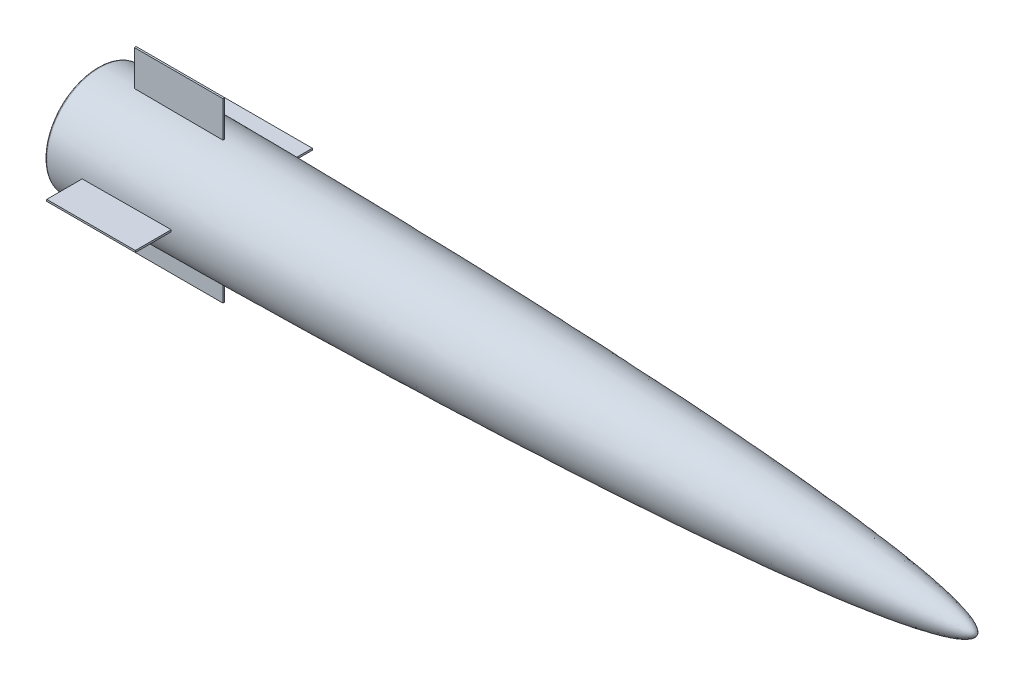
ISO-10303-21;
HEADER;
FILE_DESCRIPTION(('STEP AP214'),'2;1');
FILE_NAME('part.step','',(''),(''),'','','');
FILE_SCHEMA(('AUTOMOTIVE_DESIGN { 1 0 10303 214 1 1 1 1 }'));
ENDSEC;
DATA;
#1=APPLICATION_CONTEXT('core data for automotive mechanical design processes');
#2=APPLICATION_PROTOCOL_DEFINITION('international standard','automotive_design',2000,#1);
#3=PRODUCT_CONTEXT('',#1,'mechanical');
#4=PRODUCT('Part','Part','',(#3));
#5=PRODUCT_RELATED_PRODUCT_CATEGORY('part','',(#4));
#6=PRODUCT_DEFINITION_FORMATION('','',#4);
#7=PRODUCT_DEFINITION_CONTEXT('part definition',#1,'design');
#8=PRODUCT_DEFINITION('design','',#6,#7);
#9=PRODUCT_DEFINITION_SHAPE('','',#8);
#10=(LENGTH_UNIT() NAMED_UNIT(*) SI_UNIT(.MILLI.,.METRE.));
#11=(NAMED_UNIT(*) PLANE_ANGLE_UNIT() SI_UNIT($,.RADIAN.));
#12=(NAMED_UNIT(*) SI_UNIT($,.STERADIAN.) SOLID_ANGLE_UNIT());
#13=UNCERTAINTY_MEASURE_WITH_UNIT(LENGTH_MEASURE(1.E-05),#10,'distance_accuracy_value','');
#14=(GEOMETRIC_REPRESENTATION_CONTEXT(3) GLOBAL_UNCERTAINTY_ASSIGNED_CONTEXT((#13)) GLOBAL_UNIT_ASSIGNED_CONTEXT((#10,
#11,#12)) REPRESENTATION_CONTEXT('',''));
#15=CARTESIAN_POINT('',(0.,0.,0.));
#16=DIRECTION('',(0.,0.,1.));
#17=DIRECTION('',(1.,0.,0.));
#18=AXIS2_PLACEMENT_3D('',#15,#16,#17);
#19=CARTESIAN_POINT('',(-990.,0.,0.));
#20=DIRECTION('',(0.,0.,1.));
#21=DIRECTION('',(0.,1.,0.));
#22=AXIS2_PLACEMENT_3D('',#19,#20,#21);
#23=ELLIPSE('',#22,60.,10.);
#24=TRIMMED_CURVE('',#23,(PARAMETER_VALUE(4.71238898038468)),
(PARAMETER_VALUE(7.85398163397449)),.T.,.PARAMETER.);
#25=CARTESIAN_POINT('',(-1000.,-3.49148133884313E-13,0.));
#26=DIRECTION('',(-1.,0.,0.));
#27=AXIS1_PLACEMENT('',#25,#26);
#28=SURFACE_OF_REVOLUTION('',#24,#27);
#29=CARTESIAN_POINT('',(-1000.,-3.49148133884313E-13,0.));
#30=VERTEX_POINT('',#29);
#31=VERTEX_LOOP('',#30);
#32=FACE_BOUND('',#31,.T.);
#33=CARTESIAN_POINT('',(-990.,-3.38673689867784E-13,0.));
#34=DIRECTION('',(-1.,0.,0.));
#35=DIRECTION('',(0.,-1.,0.));
#36=AXIS2_PLACEMENT_3D('',#33,#34,#35);
#37=CIRCLE('',#36,60.0000000000003);
#38=CARTESIAN_POINT('',(-990.,-60.0000000000007,0.));
#39=VERTEX_POINT('',#38);
#40=EDGE_CURVE('E251',#39,#39,#37,.T.);
#41=ORIENTED_EDGE('',*,*,#40,.T.);
#42=EDGE_LOOP('',(#41));
#43=FACE_BOUND('',#42,.T.);
#44=ADVANCED_FACE('F42',(#32,#43),#28,.T.);
#45=CARTESIAN_POINT('',(-990.,0.,0.));
#46=DIRECTION('',(0.,0.,1.));
#47=DIRECTION('',(-1.,0.,0.));
#48=AXIS2_PLACEMENT_3D('',#45,#46,#47);
#49=ELLIPSE('',#48,990.,60.);
#50=TRIMMED_CURVE('',#49,(PARAMETER_VALUE(3.1415926535898)),(PARAMETER_VALUE(6.28318530717961)),
.T.,.PARAMETER.);
#51=CARTESIAN_POINT('',(-1000.,-3.49148133884313E-13,0.));
#52=DIRECTION('',(-1.,0.,0.));
#53=AXIS1_PLACEMENT('',#51,#52);
#54=SURFACE_OF_REVOLUTION('',#50,#53);
#55=CARTESIAN_POINT('',(-850.,-1.92031473636372E-13,0.));
#56=DIRECTION('',(-1.,0.,0.));
#57=DIRECTION('',(0.,-1.,0.));
#58=AXIS2_PLACEMENT_3D('',#55,#56,#57);
#59=CIRCLE('',#58,59.397031459402);
#60=CARTESIAN_POINT('',(-850.,0.999999999998913,-59.388612933703));
#61=VERTEX_POINT('',#60);
#62=CARTESIAN_POINT('',(-850.,-1.00000000000108,-59.3886129337029));
#63=VERTEX_POINT('',#62);
#64=EDGE_CURVE('E55',#61,#63,#59,.T.);
#65=ORIENTED_EDGE('',*,*,#64,.F.);
#66=CARTESIAN_POINT('',(-850.,0.999999999998912,-59.3886129337029));
#67=CARTESIAN_POINT('',(-854.166589941151,0.999999999998908,-59.4246902327038));
#68=CARTESIAN_POINT('',(-858.33319409252,0.999999999998904,-59.4591248088546));
#69=CARTESIAN_POINT('',(-866.666420572331,0.999999999998896,-59.5247241075129));
#70=CARTESIAN_POINT('',(-870.833042900726,0.999999999998891,-59.555888835957));
#71=CARTESIAN_POINT('',(-879.166305615929,0.999999999998882,-59.6149641266672));
#72=CARTESIAN_POINT('',(-883.33294600271,0.999999999998878,-59.6428746928422));
#73=CARTESIAN_POINT('',(-891.666244741786,0.999999999998869,-59.6954551993926));
#74=CARTESIAN_POINT('',(-895.83290309407,0.999999999998865,-59.7201251416959));
#75=CARTESIAN_POINT('',(-904.166237595471,0.999999999998856,-59.7662364200167));
#76=CARTESIAN_POINT('',(-908.332913744589,0.999999999998851,-59.7876777560845));
#77=CARTESIAN_POINT('',(-916.666283889618,0.999999999998843,-59.8273421579692));
#78=CARTESIAN_POINT('',(-920.83297788554,0.999999999998838,-59.8455652218311));
#79=CARTESIAN_POINT('',(-929.16638368884,0.99999999999883,-59.8788019381598));
#80=CARTESIAN_POINT('',(-933.333095496234,0.999999999998825,-59.8938155867647));
#81=CARTESIAN_POINT('',(-941.666536898786,0.999999999998816,-59.9206403385491));
#82=CARTESIAN_POINT('',(-945.833266493963,0.999999999998812,-59.932451435981));
#83=CARTESIAN_POINT('',(-950.,0.999999999998807,-59.9426646777447));
#84=B_SPLINE_CURVE_WITH_KNOTS('',3,(#66,#67,#68,#69,#70,#71,#72,#73,#74,#75,#76,#77,#78,#79,#80,
#81,#82,#83),.UNSPECIFIED.,.F.,.F.,(4,2,2,2,2,2,2,2,4),(0.,12.5002380451016,25.0004533949478,
37.5006537296599,50.000846627544,62.5010393300494,75.0012396256015,87.5014549624844,
100.001692733604),.UNSPECIFIED.);
#85=CARTESIAN_POINT('',(-950.,0.999999999998808,-59.9426646777447));
#86=VERTEX_POINT('',#85);
#87=EDGE_CURVE('E11',#61,#86,#84,.T.);
#88=ORIENTED_EDGE('',*,*,#87,.T.);
#89=CARTESIAN_POINT('',(-950.,-2.96775913801666E-13,0.));
#90=DIRECTION('',(-1.,0.,0.));
#91=DIRECTION('',(0.,-1.,0.));
#92=AXIS2_PLACEMENT_3D('',#89,#90,#91);
#93=CIRCLE('',#92,59.9510054016489);
#94=CARTESIAN_POINT('',(-950.,-1.00000000000119,-59.9426646777446));
#95=VERTEX_POINT('',#94);
#96=EDGE_CURVE('E321',#95,#86,#93,.F.);
#97=ORIENTED_EDGE('',*,*,#96,.F.);
#98=CARTESIAN_POINT('',(-850.,-1.00000000000108,-59.3886129337029));
#99=CARTESIAN_POINT('',(-854.166589941151,-1.00000000000109,-59.4246902327038));
#100=CARTESIAN_POINT('',(-858.33319409252,-1.0000000000011,-59.4591248088546));
#101=CARTESIAN_POINT('',(-866.666420572331,-1.00000000000111,-59.5247241075129));
#102=CARTESIAN_POINT('',(-870.833042900726,-1.00000000000111,-59.5558888359569));
#103=CARTESIAN_POINT('',(-879.166305615929,-1.00000000000112,-59.6149641266672));
#104=CARTESIAN_POINT('',(-883.33294600271,-1.00000000000112,-59.6428746928421));
#105=CARTESIAN_POINT('',(-891.666244741786,-1.00000000000113,-59.6954551993925));
#106=CARTESIAN_POINT('',(-895.83290309407,-1.00000000000114,-59.7201251416959));
#107=CARTESIAN_POINT('',(-904.166237595471,-1.00000000000114,-59.7662364200166));
#108=CARTESIAN_POINT('',(-908.332913744589,-1.00000000000115,-59.7876777560845));
#109=CARTESIAN_POINT('',(-916.666283889618,-1.00000000000116,-59.8273421579692));
#110=CARTESIAN_POINT('',(-920.83297788554,-1.00000000000116,-59.8455652218311));
#111=CARTESIAN_POINT('',(-929.16638368884,-1.00000000000117,-59.8788019381598));
#112=CARTESIAN_POINT('',(-933.333095496234,-1.00000000000117,-59.8938155867647));
#113=CARTESIAN_POINT('',(-941.666536898786,-1.00000000000118,-59.9206403385491));
#114=CARTESIAN_POINT('',(-945.833266493963,-1.00000000000119,-59.9324514359809));
#115=CARTESIAN_POINT('',(-950.,-1.00000000000119,-59.9426646777446));
#116=B_SPLINE_CURVE_WITH_KNOTS('',3,(#98,#99,#100,#101,#102,#103,#104,#105,#106,#107,#108,#109,
#110,#111,#112,#113,#114,#115),.UNSPECIFIED.,.F.,.F.,(4,2,2,2,2,2,2,2,4),(0.,12.5002380451016,
25.0004533949478,37.5006537296599,50.0008466275439,62.5010393300493,75.0012396256014,
87.5014549624843,100.001692733604),.UNSPECIFIED.);
#117=EDGE_CURVE('E314',#63,#95,#116,.T.);
#118=ORIENTED_EDGE('',*,*,#117,.F.);
#119=EDGE_LOOP('',(#65,#88,#97,#118));
#120=FACE_BOUND('',#119,.T.);
#121=CARTESIAN_POINT('',(-850.,-59.3886129337031,-1.));
#122=VERTEX_POINT('',#121);
#123=CARTESIAN_POINT('',(-850.,-59.3886129337031,0.999999999999995));
#124=VERTEX_POINT('',#123);
#125=EDGE_CURVE('E389',#122,#124,#59,.T.);
#126=ORIENTED_EDGE('',*,*,#125,.F.);
#127=CARTESIAN_POINT('',(-850.,-59.3886129337031,-1.));
#128=CARTESIAN_POINT('',(-854.166589941151,-59.424690232704,-1.));
#129=CARTESIAN_POINT('',(-858.33319409252,-59.4591248088548,-1.));
#130=CARTESIAN_POINT('',(-866.666420572331,-59.5247241075131,-1.));
#131=CARTESIAN_POINT('',(-870.833042900726,-59.5558888359572,-1.));
#132=CARTESIAN_POINT('',(-879.166305615929,-59.6149641266674,-1.));
#133=CARTESIAN_POINT('',(-883.33294600271,-59.6428746928424,-1.));
#134=CARTESIAN_POINT('',(-891.666244741786,-59.6954551993928,-1.));
#135=CARTESIAN_POINT('',(-895.83290309407,-59.7201251416961,-1.));
#136=CARTESIAN_POINT('',(-904.166237595471,-59.7662364200169,-1.));
#137=CARTESIAN_POINT('',(-908.332913744589,-59.7876777560848,-1.));
#138=CARTESIAN_POINT('',(-916.666283889618,-59.8273421579695,-1.));
#139=CARTESIAN_POINT('',(-920.83297788554,-59.8455652218314,-1.));
#140=CARTESIAN_POINT('',(-929.16638368884,-59.8788019381601,-1.));
#141=CARTESIAN_POINT('',(-933.333095496234,-59.893815586765,-1.));
#142=CARTESIAN_POINT('',(-941.666536898786,-59.9206403385494,-1.));
#143=CARTESIAN_POINT('',(-945.833266493963,-59.9324514359812,-1.));
#144=CARTESIAN_POINT('',(-950.,-59.942664677745,-1.));
#145=B_SPLINE_CURVE_WITH_KNOTS('',3,(#127,#128,#129,#130,#131,#132,#133,#134,#135,#136,#137,
#138,#139,#140,#141,#142,#143,#144),.UNSPECIFIED.,.F.,.F.,(4,2,2,2,2,2,2,2,4),(0.,
12.5002380451016,25.0004533949478,37.5006537296599,50.0008466275439,62.5010393300493,
75.0012396256014,87.5014549624843,100.001692733604),.UNSPECIFIED.);
#146=CARTESIAN_POINT('',(-950.,-59.942664677745,-1.));
#147=VERTEX_POINT('',#146);
#148=EDGE_CURVE('E308',#122,#147,#145,.T.);
#149=ORIENTED_EDGE('',*,*,#148,.T.);
#150=CARTESIAN_POINT('',(-950.,-59.942664677745,1.));
#151=VERTEX_POINT('',#150);
#152=EDGE_CURVE('E386',#151,#147,#93,.F.);
#153=ORIENTED_EDGE('',*,*,#152,.F.);
#154=CARTESIAN_POINT('',(-850.,-59.3886129337031,0.999999999999995));
#155=CARTESIAN_POINT('',(-854.166589941151,-59.424690232704,0.999999999999998));
#156=CARTESIAN_POINT('',(-858.33319409252,-59.4591248088548,1.));
#157=CARTESIAN_POINT('',(-866.666420572331,-59.5247241075131,1.));
#158=CARTESIAN_POINT('',(-870.833042900726,-59.5558888359572,1.));
#159=CARTESIAN_POINT('',(-879.166305615929,-59.6149641266674,1.));
#160=CARTESIAN_POINT('',(-883.33294600271,-59.6428746928424,1.));
#161=CARTESIAN_POINT('',(-891.666244741786,-59.6954551993928,1.));
#162=CARTESIAN_POINT('',(-895.83290309407,-59.7201251416961,1.));
#163=CARTESIAN_POINT('',(-904.166237595471,-59.7662364200169,1.));
#164=CARTESIAN_POINT('',(-908.332913744589,-59.7876777560848,1.));
#165=CARTESIAN_POINT('',(-916.666283889618,-59.8273421579695,1.));
#166=CARTESIAN_POINT('',(-920.83297788554,-59.8455652218314,1.));
#167=CARTESIAN_POINT('',(-929.16638368884,-59.8788019381601,1.));
#168=CARTESIAN_POINT('',(-933.333095496234,-59.893815586765,1.));
#169=CARTESIAN_POINT('',(-941.666536898786,-59.9206403385494,0.999999999999999));
#170=CARTESIAN_POINT('',(-945.833266493963,-59.9324514359812,0.999999999999996));
#171=CARTESIAN_POINT('',(-950.,-59.942664677745,0.999999999999989));
#172=B_SPLINE_CURVE_WITH_KNOTS('',3,(#154,#155,#156,#157,#158,#159,#160,#161,#162,#163,#164,
#165,#166,#167,#168,#169,#170,#171),.UNSPECIFIED.,.F.,.F.,(4,2,2,2,2,2,2,2,4),(0.,
12.5002380451016,25.0004533949478,37.5006537296599,50.0008466275439,62.5010393300493,
75.0012396256014,87.5014549624843,100.001692733604),.UNSPECIFIED.);
#173=EDGE_CURVE('E301',#124,#151,#172,.T.);
#174=ORIENTED_EDGE('',*,*,#173,.F.);
#175=EDGE_LOOP('',(#126,#149,#153,#174));
#176=FACE_BOUND('',#175,.T.);
#177=CARTESIAN_POINT('',(-950.,0.999999999999226,59.9426646777447));
#178=VERTEX_POINT('',#177);
#179=CARTESIAN_POINT('',(-950.,-1.00000000000035,59.9426646777447));
#180=VERTEX_POINT('',#179);
#181=EDGE_CURVE('E381',#178,#180,#93,.F.);
#182=ORIENTED_EDGE('',*,*,#181,.F.);
#183=CARTESIAN_POINT('',(-950.,0.999999999999218,59.9426646777447));
#184=CARTESIAN_POINT('',(-945.833266493964,0.999999999999228,59.9324514359809));
#185=CARTESIAN_POINT('',(-941.666536898787,0.999999999999234,59.9206403385491));
#186=CARTESIAN_POINT('',(-933.333095496235,0.999999999999245,59.8938155867647));
#187=CARTESIAN_POINT('',(-929.166383688841,0.999999999999248,59.8788019381598));
#188=CARTESIAN_POINT('',(-920.832977885541,0.999999999999256,59.8455652218311));
#189=CARTESIAN_POINT('',(-916.666283889619,0.99999999999926,59.8273421579692));
#190=CARTESIAN_POINT('',(-908.332913744589,0.999999999999269,59.7876777560845));
#191=CARTESIAN_POINT('',(-904.166237595472,0.999999999999273,59.7662364200167));
#192=CARTESIAN_POINT('',(-895.83290309407,0.999999999999282,59.7201251416959));
#193=CARTESIAN_POINT('',(-891.666244741786,0.999999999999286,59.6954551993926));
#194=CARTESIAN_POINT('',(-883.33294600271,0.999999999999294,59.6428746928422));
#195=CARTESIAN_POINT('',(-879.166305615929,0.999999999999299,59.6149641266672));
#196=CARTESIAN_POINT('',(-870.833042900726,0.999999999999307,59.555888835957));
#197=CARTESIAN_POINT('',(-866.666420572331,0.999999999999312,59.5247241075129));
#198=CARTESIAN_POINT('',(-858.33319409252,0.999999999999319,59.4591248088546));
#199=CARTESIAN_POINT('',(-854.166589941151,0.999999999999321,59.4246902327038));
#200=CARTESIAN_POINT('',(-850.,0.999999999999321,59.3886129337029));
#201=B_SPLINE_CURVE_WITH_KNOTS('',3,(#183,#184,#185,#186,#187,#188,#189,#190,#191,#192,#193,
#194,#195,#196,#197,#198,#199,#200),.UNSPECIFIED.,.F.,.F.,(4,2,2,2,2,2,2,2,4),(0.,
12.50023777112,25.0004531080031,37.5006534035552,50.0008461060607,62.501039003945,
75.0012393386571,87.5014546885033,100.001692733605),.UNSPECIFIED.);
#202=CARTESIAN_POINT('',(-850.,0.999999999999328,59.3886129337029));
#203=VERTEX_POINT('',#202);
#204=EDGE_CURVE('E293',#178,#203,#201,.T.);
#205=ORIENTED_EDGE('',*,*,#204,.T.);
#206=CARTESIAN_POINT('',(-850.,-1.00000000000026,59.3886129337029));
#207=VERTEX_POINT('',#206);
#208=EDGE_CURVE('E385',#207,#203,#59,.T.);
#209=ORIENTED_EDGE('',*,*,#208,.F.);
#210=CARTESIAN_POINT('',(-850.,-1.00000000000025,59.3886129337029));
#211=CARTESIAN_POINT('',(-854.166589941151,-1.00000000000026,59.4246902327038));
#212=CARTESIAN_POINT('',(-858.33319409252,-1.00000000000026,59.4591248088546));
#213=CARTESIAN_POINT('',(-866.666420572331,-1.00000000000027,59.5247241075129));
#214=CARTESIAN_POINT('',(-870.833042900726,-1.00000000000028,59.555888835957));
#215=CARTESIAN_POINT('',(-879.166305615929,-1.00000000000029,59.6149641266672));
#216=CARTESIAN_POINT('',(-883.33294600271,-1.00000000000029,59.6428746928422));
#217=CARTESIAN_POINT('',(-891.666244741786,-1.0000000000003,59.6954551993926));
#218=CARTESIAN_POINT('',(-895.83290309407,-1.0000000000003,59.7201251416959));
#219=CARTESIAN_POINT('',(-904.166237595471,-1.00000000000031,59.7662364200167));
#220=CARTESIAN_POINT('',(-908.332913744589,-1.00000000000031,59.7876777560845));
#221=CARTESIAN_POINT('',(-916.666283889618,-1.00000000000032,59.8273421579692));
#222=CARTESIAN_POINT('',(-920.83297788554,-1.00000000000033,59.8455652218311));
#223=CARTESIAN_POINT('',(-929.16638368884,-1.00000000000033,59.8788019381598));
#224=CARTESIAN_POINT('',(-933.333095496234,-1.00000000000034,59.8938155867647));
#225=CARTESIAN_POINT('',(-941.666536898786,-1.00000000000035,59.9206403385491));
#226=CARTESIAN_POINT('',(-945.833266493963,-1.00000000000035,59.9324514359809));
#227=CARTESIAN_POINT('',(-950.,-1.00000000000035,59.9426646777447));
#228=B_SPLINE_CURVE_WITH_KNOTS('',3,(#210,#211,#212,#213,#214,#215,#216,#217,#218,#219,#220,
#221,#222,#223,#224,#225,#226,#227),.UNSPECIFIED.,.F.,.F.,(4,2,2,2,2,2,2,2,4),(0.,
12.5002380451016,25.0004533949478,37.5006537296599,50.0008466275439,62.5010393300493,
75.0012396256014,87.5014549624843,100.001692733604),.UNSPECIFIED.);
#229=EDGE_CURVE('E167',#207,#180,#228,.T.);
#230=ORIENTED_EDGE('',*,*,#229,.T.);
#231=EDGE_LOOP('',(#182,#205,#209,#230));
#232=FACE_BOUND('',#231,.T.);
#233=CARTESIAN_POINT('',(-850.,-1.92031473636372E-13,0.));
#234=DIRECTION('',(-1.,0.,0.));
#235=DIRECTION('',(0.,-1.,0.));
#236=AXIS2_PLACEMENT_3D('',#233,#234,#235);
#237=CIRCLE('',#236,59.397031459402);
#238=CARTESIAN_POINT('',(-850.,59.3886129337027,1.));
#239=VERTEX_POINT('',#238);
#240=CARTESIAN_POINT('',(-850.,59.3886129337027,-1.));
#241=VERTEX_POINT('',#240);
#242=EDGE_CURVE('E375',#239,#241,#237,.T.);
#243=ORIENTED_EDGE('',*,*,#242,.F.);
#244=CARTESIAN_POINT('',(-850.,59.3886129337027,1.00000000000001));
#245=CARTESIAN_POINT('',(-854.166589941151,59.4246902327036,1.));
#246=CARTESIAN_POINT('',(-858.333194092521,59.4591248088544,1.));
#247=CARTESIAN_POINT('',(-866.666420572331,59.5247241075127,1.));
#248=CARTESIAN_POINT('',(-870.833042900726,59.5558888359568,1.));
#249=CARTESIAN_POINT('',(-879.166305615929,59.614964126667,1.));
#250=CARTESIAN_POINT('',(-883.33294600271,59.6428746928419,1.));
#251=CARTESIAN_POINT('',(-891.666244741786,59.6954551993923,1.));
#252=CARTESIAN_POINT('',(-895.83290309407,59.7201251416957,1.));
#253=CARTESIAN_POINT('',(-904.166237595471,59.7662364200164,1.));
#254=CARTESIAN_POINT('',(-908.332913744589,59.7876777560843,1.));
#255=CARTESIAN_POINT('',(-916.666283889619,59.8273421579689,1.));
#256=CARTESIAN_POINT('',(-920.83297788554,59.8455652218309,1.));
#257=CARTESIAN_POINT('',(-929.16638368884,59.8788019381596,1.));
#258=CARTESIAN_POINT('',(-933.333095496234,59.8938155867645,0.999999999999999));
#259=CARTESIAN_POINT('',(-941.666536898786,59.9206403385488,1.));
#260=CARTESIAN_POINT('',(-945.833266493963,59.9324514359807,1.));
#261=CARTESIAN_POINT('',(-950.,59.9426646777444,1.00000000000001));
#262=B_SPLINE_CURVE_WITH_KNOTS('',3,(#244,#245,#246,#247,#248,#249,#250,#251,#252,#253,#254,
#255,#256,#257,#258,#259,#260,#261),.UNSPECIFIED.,.F.,.F.,(4,2,2,2,2,2,2,2,4),(0.,
12.5002380451017,25.0004533949476,37.5006537296599,50.0008466275439,62.5010393300493,
75.0012396256013,87.5014549624843,100.001692733604),.UNSPECIFIED.);
#263=CARTESIAN_POINT('',(-950.,59.9426646777444,1.));
#264=VERTEX_POINT('',#263);
#265=EDGE_CURVE('E276',#239,#264,#262,.T.);
#266=ORIENTED_EDGE('',*,*,#265,.T.);
#267=CARTESIAN_POINT('',(-950.,-2.96775913801666E-13,0.));
#268=DIRECTION('',(-1.,0.,0.));
#269=DIRECTION('',(0.,-1.,0.));
#270=AXIS2_PLACEMENT_3D('',#267,#268,#269);
#271=CIRCLE('',#270,59.9510054016489);
#272=CARTESIAN_POINT('',(-950.,59.9426646777444,-1.));
#273=VERTEX_POINT('',#272);
#274=EDGE_CURVE('E371',#273,#264,#271,.F.);
#275=ORIENTED_EDGE('',*,*,#274,.F.);
#276=CARTESIAN_POINT('',(-850.,59.3886129337027,-1.));
#277=CARTESIAN_POINT('',(-854.166589941151,59.4246902327036,-1.));
#278=CARTESIAN_POINT('',(-858.333194092521,59.4591248088544,-1.));
#279=CARTESIAN_POINT('',(-866.666420572331,59.5247241075127,-1.));
#280=CARTESIAN_POINT('',(-870.833042900726,59.5558888359568,-1.));
#281=CARTESIAN_POINT('',(-879.166305615929,59.614964126667,-1.));
#282=CARTESIAN_POINT('',(-883.33294600271,59.6428746928419,-1.));
#283=CARTESIAN_POINT('',(-891.666244741786,59.6954551993923,-1.));
#284=CARTESIAN_POINT('',(-895.83290309407,59.7201251416957,-1.));
#285=CARTESIAN_POINT('',(-904.166237595471,59.7662364200164,-1.));
#286=CARTESIAN_POINT('',(-908.332913744589,59.7876777560843,-1.));
#287=CARTESIAN_POINT('',(-916.666283889619,59.8273421579689,-1.));
#288=CARTESIAN_POINT('',(-920.83297788554,59.8455652218309,-1.));
#289=CARTESIAN_POINT('',(-929.16638368884,59.8788019381596,-1.));
#290=CARTESIAN_POINT('',(-933.333095496234,59.8938155867645,-1.));
#291=CARTESIAN_POINT('',(-941.666536898786,59.9206403385488,-1.));
#292=CARTESIAN_POINT('',(-945.833266493963,59.9324514359807,-1.));
#293=CARTESIAN_POINT('',(-950.,59.9426646777444,-1.));
#294=B_SPLINE_CURVE_WITH_KNOTS('',3,(#276,#277,#278,#279,#280,#281,#282,#283,#284,#285,#286,
#287,#288,#289,#290,#291,#292,#293),.UNSPECIFIED.,.F.,.F.,(4,2,2,2,2,2,2,2,4),(0.,
12.5002380451017,25.0004533949476,37.5006537296599,50.0008466275439,62.5010393300493,
75.0012396256013,87.5014549624843,100.001692733604),.UNSPECIFIED.);
#295=EDGE_CURVE('E266',#241,#273,#294,.T.);
#296=ORIENTED_EDGE('',*,*,#295,.F.);
#297=EDGE_LOOP('',(#243,#266,#275,#296));
#298=FACE_BOUND('',#297,.T.);
#299=ORIENTED_EDGE('',*,*,#40,.F.);
#300=EDGE_LOOP('',(#299));
#301=FACE_BOUND('',#300,.T.);
#302=CARTESIAN_POINT('',(0.,6.85431286571214E-13,0.));
#303=VERTEX_POINT('',#302);
#304=VERTEX_LOOP('',#303);
#305=FACE_BOUND('',#304,.T.);
#306=ADVANCED_FACE('F257',(#120,#176,#232,#298,#301,#305),#54,.T.);
#307=CARTESIAN_POINT('',(0.,0.,1.));
#308=DIRECTION('',(0.,0.,1.));
#309=DIRECTION('',(1.,0.,0.));
#310=AXIS2_PLACEMENT_3D('',#307,#308,#309);
#311=PLANE('',#310);
#312=ORIENTED_EDGE('',*,*,#265,.F.);
#313=DIRECTION('',(0.,1.,0.));
#314=VECTOR('',#313,1.);
#315=CARTESIAN_POINT('',(-850.,0.,1.));
#316=LINE('',#315,#314);
#317=CARTESIAN_POINT('',(-850.,100.,1.));
#318=VERTEX_POINT('',#317);
#319=EDGE_CURVE('E233',#239,#318,#316,.T.);
#320=ORIENTED_EDGE('',*,*,#319,.T.);
#321=DIRECTION('',(-1.,0.,0.));
#322=VECTOR('',#321,1.);
#323=CARTESIAN_POINT('',(-950.,100.,1.));
#324=LINE('',#323,#322);
#325=CARTESIAN_POINT('',(-950.,100.,1.));
#326=VERTEX_POINT('',#325);
#327=EDGE_CURVE('E235',#318,#326,#324,.T.);
#328=ORIENTED_EDGE('',*,*,#327,.T.);
#329=DIRECTION('',(0.,-1.,0.));
#330=VECTOR('',#329,1.);
#331=CARTESIAN_POINT('',(-950.,0.,1.));
#332=LINE('',#331,#330);
#333=EDGE_CURVE('E238',#326,#264,#332,.T.);
#334=ORIENTED_EDGE('',*,*,#333,.T.);
#335=EDGE_LOOP('',(#312,#320,#328,#334));
#336=FACE_BOUND('',#335,.T.);
#337=ADVANCED_FACE('F261',(#336),#311,.T.);
#338=CARTESIAN_POINT('',(0.,0.,-1.));
#339=DIRECTION('',(0.,0.,1.));
#340=DIRECTION('',(1.,0.,0.));
#341=AXIS2_PLACEMENT_3D('',#338,#339,#340);
#342=PLANE('',#341);
#343=DIRECTION('',(0.,1.,0.));
#344=VECTOR('',#343,1.);
#345=CARTESIAN_POINT('',(-850.,0.,-1.));
#346=LINE('',#345,#344);
#347=CARTESIAN_POINT('',(-850.,100.,-1.));
#348=VERTEX_POINT('',#347);
#349=EDGE_CURVE('E232',#241,#348,#346,.T.);
#350=ORIENTED_EDGE('',*,*,#349,.F.);
#351=ORIENTED_EDGE('',*,*,#295,.T.);
#352=DIRECTION('',(0.,-1.,0.));
#353=VECTOR('',#352,1.);
#354=CARTESIAN_POINT('',(-950.,0.,-1.));
#355=LINE('',#354,#353);
#356=CARTESIAN_POINT('',(-950.,100.,-1.));
#357=VERTEX_POINT('',#356);
#358=EDGE_CURVE('E236',#357,#273,#355,.T.);
#359=ORIENTED_EDGE('',*,*,#358,.F.);
#360=DIRECTION('',(-1.,0.,0.));
#361=VECTOR('',#360,1.);
#362=CARTESIAN_POINT('',(-950.,100.,-1.));
#363=LINE('',#362,#361);
#364=EDGE_CURVE('E243',#348,#357,#363,.T.);
#365=ORIENTED_EDGE('',*,*,#364,.F.);
#366=EDGE_LOOP('',(#350,#351,#359,#365));
#367=FACE_BOUND('',#366,.T.);
#368=ADVANCED_FACE('F346',(#367),#342,.F.);
#369=CARTESIAN_POINT('',(-850.,0.,1.));
#370=DIRECTION('',(-1.,0.,0.));
#371=DIRECTION('',(0.,0.,1.));
#372=AXIS2_PLACEMENT_3D('',#369,#370,#371);
#373=PLANE('',#372);
#374=ORIENTED_EDGE('',*,*,#319,.F.);
#375=ORIENTED_EDGE('',*,*,#242,.T.);
#376=ORIENTED_EDGE('',*,*,#349,.T.);
#377=DIRECTION('',(0.,0.,-1.));
#378=VECTOR('',#377,1.);
#379=CARTESIAN_POINT('',(-850.,100.,1.));
#380=LINE('',#379,#378);
#381=EDGE_CURVE('E249',#318,#348,#380,.T.);
#382=ORIENTED_EDGE('',*,*,#381,.F.);
#383=EDGE_LOOP('',(#374,#375,#376,#382));
#384=FACE_BOUND('',#383,.T.);
#385=ADVANCED_FACE('F262',(#384),#373,.F.);
#386=CARTESIAN_POINT('',(-950.,100.,1.));
#387=DIRECTION('',(0.,-1.,0.));
#388=DIRECTION('',(1.,0.,0.));
#389=AXIS2_PLACEMENT_3D('',#386,#387,#388);
#390=PLANE('',#389);
#391=ORIENTED_EDGE('',*,*,#364,.T.);
#392=DIRECTION('',(0.,0.,-1.));
#393=VECTOR('',#392,1.);
#394=CARTESIAN_POINT('',(-950.,100.,1.));
#395=LINE('',#394,#393);
#396=EDGE_CURVE('E241',#326,#357,#395,.T.);
#397=ORIENTED_EDGE('',*,*,#396,.F.);
#398=ORIENTED_EDGE('',*,*,#327,.F.);
#399=ORIENTED_EDGE('',*,*,#381,.T.);
#400=EDGE_LOOP('',(#391,#397,#398,#399));
#401=FACE_BOUND('',#400,.T.);
#402=ADVANCED_FACE('F354',(#401),#390,.F.);
#403=CARTESIAN_POINT('',(-950.,0.,1.));
#404=DIRECTION('',(1.,0.,0.));
#405=DIRECTION('',(0.,1.,0.));
#406=AXIS2_PLACEMENT_3D('',#403,#404,#405);
#407=PLANE('',#406);
#408=ORIENTED_EDGE('',*,*,#358,.T.);
#409=ORIENTED_EDGE('',*,*,#274,.T.);
#410=ORIENTED_EDGE('',*,*,#333,.F.);
#411=ORIENTED_EDGE('',*,*,#396,.T.);
#412=EDGE_LOOP('',(#408,#409,#410,#411));
#413=FACE_BOUND('',#412,.T.);
#414=ADVANCED_FACE('F352',(#413),#407,.F.);
#415=CARTESIAN_POINT('',(-950.,-0.999999999999935,100.000000000001));
#416=DIRECTION('',(0.,0.,-1.));
#417=DIRECTION('',(0.,1.,0.));
#418=AXIS2_PLACEMENT_3D('',#415,#416,#417);
#419=PLANE('',#418);
#420=DIRECTION('',(-1.,0.,0.));
#421=VECTOR('',#420,1.);
#422=CARTESIAN_POINT('',(-950.,1.00000000000006,100.000000000001));
#423=LINE('',#422,#421);
#424=CARTESIAN_POINT('',(-850.,1.00000000000017,100.000000000001));
#425=VERTEX_POINT('',#424);
#426=CARTESIAN_POINT('',(-950.,1.00000000000006,100.000000000001));
#427=VERTEX_POINT('',#426);
#428=EDGE_CURVE('E170',#425,#427,#423,.T.);
#429=ORIENTED_EDGE('',*,*,#428,.T.);
#430=DIRECTION('',(0.,1.,0.));
#431=VECTOR('',#430,1.);
#432=CARTESIAN_POINT('',(-950.,-0.999999999999935,100.000000000001));
#433=LINE('',#432,#431);
#434=CARTESIAN_POINT('',(-950.,-0.999999999999935,100.000000000001));
#435=VERTEX_POINT('',#434);
#436=EDGE_CURVE('E181',#435,#427,#433,.T.);
#437=ORIENTED_EDGE('',*,*,#436,.F.);
#438=DIRECTION('',(-1.,0.,0.));
#439=VECTOR('',#438,1.);
#440=CARTESIAN_POINT('',(-950.,-0.999999999999935,100.000000000001));
#441=LINE('',#440,#439);
#442=CARTESIAN_POINT('',(-850.,-0.999999999999832,100.000000000001));
#443=VERTEX_POINT('',#442);
#444=EDGE_CURVE('E164',#443,#435,#441,.T.);
#445=ORIENTED_EDGE('',*,*,#444,.F.);
#446=DIRECTION('',(0.,1.,0.));
#447=VECTOR('',#446,1.);
#448=CARTESIAN_POINT('',(-850.,-0.999999999999832,100.000000000001));
#449=LINE('',#448,#447);
#450=EDGE_CURVE('E173',#443,#425,#449,.T.);
#451=ORIENTED_EDGE('',*,*,#450,.T.);
#452=EDGE_LOOP('',(#429,#437,#445,#451));
#453=FACE_BOUND('',#452,.T.);
#454=ADVANCED_FACE('F183',(#453),#419,.F.);
#455=CARTESIAN_POINT('',(0.,-1.,0.));
#456=DIRECTION('',(0.,-1.,0.));
#457=DIRECTION('',(1.,0.,0.));
#458=AXIS2_PLACEMENT_3D('',#455,#456,#457);
#459=PLANE('',#458);
#460=ORIENTED_EDGE('',*,*,#229,.F.);
#461=DIRECTION('',(0.,0.,1.));
#462=VECTOR('',#461,1.);
#463=CARTESIAN_POINT('',(-850.,-1.00000000000088,9.01189315840549E-13));
#464=LINE('',#463,#462);
#465=EDGE_CURVE('E160',#207,#443,#464,.T.);
#466=ORIENTED_EDGE('',*,*,#465,.T.);
#467=ORIENTED_EDGE('',*,*,#444,.T.);
#468=DIRECTION('',(0.,0.,-1.));
#469=VECTOR('',#468,1.);
#470=CARTESIAN_POINT('',(-950.,-1.00000000000098,9.9332489344928E-13));
#471=LINE('',#470,#469);
#472=EDGE_CURVE('E186',#435,#180,#471,.T.);
#473=ORIENTED_EDGE('',*,*,#472,.T.);
#474=EDGE_LOOP('',(#460,#466,#467,#473));
#475=FACE_BOUND('',#474,.T.);
#476=ADVANCED_FACE('F162',(#475),#459,.T.);
#477=CARTESIAN_POINT('',(0.,1.,0.));
#478=DIRECTION('',(0.,1.,0.));
#479=DIRECTION('',(1.,0.,0.));
#480=AXIS2_PLACEMENT_3D('',#477,#478,#479);
#481=PLANE('',#480);
#482=ORIENTED_EDGE('',*,*,#204,.F.);
#483=DIRECTION('',(0.,0.,1.));
#484=VECTOR('',#483,1.);
#485=CARTESIAN_POINT('',(-950.,0.999999999999017,-9.86341930771593E-13));
#486=LINE('',#485,#484);
#487=EDGE_CURVE('E216',#178,#427,#486,.T.);
#488=ORIENTED_EDGE('',*,*,#487,.T.);
#489=ORIENTED_EDGE('',*,*,#428,.F.);
#490=DIRECTION('',(0.,0.,-1.));
#491=VECTOR('',#490,1.);
#492=CARTESIAN_POINT('',(-850.,0.999999999999121,-8.94206353162863E-13));
#493=LINE('',#492,#491);
#494=EDGE_CURVE('E176',#425,#203,#493,.T.);
#495=ORIENTED_EDGE('',*,*,#494,.T.);
#496=EDGE_LOOP('',(#482,#488,#489,#495));
#497=FACE_BOUND('',#496,.T.);
#498=ADVANCED_FACE('F400',(#497),#481,.T.);
#499=CARTESIAN_POINT('',(-950.,0.999999999999017,-9.86341930771593E-13));
#500=DIRECTION('',(1.,0.,0.));
#501=DIRECTION('',(0.,1.,0.));
#502=AXIS2_PLACEMENT_3D('',#499,#500,#501);
#503=PLANE('',#502);
#504=ORIENTED_EDGE('',*,*,#487,.F.);
#505=ORIENTED_EDGE('',*,*,#181,.T.);
#506=ORIENTED_EDGE('',*,*,#472,.F.);
#507=ORIENTED_EDGE('',*,*,#436,.T.);
#508=EDGE_LOOP('',(#504,#505,#506,#507));
#509=FACE_BOUND('',#508,.T.);
#510=ADVANCED_FACE('F335',(#509),#503,.F.);
#511=CARTESIAN_POINT('',(-850.,0.999999999999121,-8.94206353162863E-13));
#512=DIRECTION('',(-1.,0.,0.));
#513=DIRECTION('',(0.,-1.,0.));
#514=AXIS2_PLACEMENT_3D('',#511,#512,#513);
#515=PLANE('',#514);
#516=ORIENTED_EDGE('',*,*,#465,.F.);
#517=ORIENTED_EDGE('',*,*,#208,.T.);
#518=ORIENTED_EDGE('',*,*,#494,.F.);
#519=ORIENTED_EDGE('',*,*,#450,.F.);
#520=EDGE_LOOP('',(#516,#517,#518,#519));
#521=FACE_BOUND('',#520,.T.);
#522=ADVANCED_FACE('F174',(#521),#515,.F.);
#523=CARTESIAN_POINT('',(-950.,-100.000000000002,-1.));
#524=DIRECTION('',(0.,1.,0.));
#525=DIRECTION('',(-1.,0.,0.));
#526=AXIS2_PLACEMENT_3D('',#523,#524,#525);
#527=PLANE('',#526);
#528=DIRECTION('',(-1.,0.,0.));
#529=VECTOR('',#528,1.);
#530=CARTESIAN_POINT('',(-950.,-100.000000000002,1.));
#531=LINE('',#530,#529);
#532=CARTESIAN_POINT('',(-850.,-100.000000000002,1.));
#533=VERTEX_POINT('',#532);
#534=CARTESIAN_POINT('',(-950.,-100.000000000002,1.));
#535=VERTEX_POINT('',#534);
#536=EDGE_CURVE('E202',#533,#535,#531,.T.);
#537=ORIENTED_EDGE('',*,*,#536,.T.);
#538=DIRECTION('',(0.,0.,1.));
#539=VECTOR('',#538,1.);
#540=CARTESIAN_POINT('',(-950.,-100.000000000002,-1.));
#541=LINE('',#540,#539);
#542=CARTESIAN_POINT('',(-950.,-100.000000000002,-1.));
#543=VERTEX_POINT('',#542);
#544=EDGE_CURVE('E200',#543,#535,#541,.T.);
#545=ORIENTED_EDGE('',*,*,#544,.F.);
#546=DIRECTION('',(-1.,0.,0.));
#547=VECTOR('',#546,1.);
#548=CARTESIAN_POINT('',(-950.,-100.000000000002,-1.));
#549=LINE('',#548,#547);
#550=CARTESIAN_POINT('',(-850.,-100.000000000002,-1.));
#551=VERTEX_POINT('',#550);
#552=EDGE_CURVE('E194',#551,#543,#549,.T.);
#553=ORIENTED_EDGE('',*,*,#552,.F.);
#554=DIRECTION('',(0.,0.,1.));
#555=VECTOR('',#554,1.);
#556=CARTESIAN_POINT('',(-850.,-100.000000000002,-1.));
#557=LINE('',#556,#555);
#558=EDGE_CURVE('E208',#551,#533,#557,.T.);
#559=ORIENTED_EDGE('',*,*,#558,.T.);
#560=EDGE_LOOP('',(#537,#545,#553,#559));
#561=FACE_BOUND('',#560,.T.);
#562=ADVANCED_FACE('F341',(#561),#527,.F.);
#563=CARTESIAN_POINT('',(0.,0.,-1.));
#564=DIRECTION('',(0.,0.,-1.));
#565=DIRECTION('',(1.,0.,0.));
#566=AXIS2_PLACEMENT_3D('',#563,#564,#565);
#567=PLANE('',#566);
#568=ORIENTED_EDGE('',*,*,#148,.F.);
#569=DIRECTION('',(0.,-1.,0.));
#570=VECTOR('',#569,1.);
#571=CARTESIAN_POINT('',(-850.,-1.77010737921122E-12,-1.));
#572=LINE('',#571,#570);
#573=EDGE_CURVE('E192',#122,#551,#572,.T.);
#574=ORIENTED_EDGE('',*,*,#573,.T.);
#575=ORIENTED_EDGE('',*,*,#552,.T.);
#576=DIRECTION('',(0.,1.,0.));
#577=VECTOR('',#576,1.);
#578=CARTESIAN_POINT('',(-950.,-1.9657008988655E-12,-1.));
#579=LINE('',#578,#577);
#580=EDGE_CURVE('E197',#543,#147,#579,.T.);
#581=ORIENTED_EDGE('',*,*,#580,.T.);
#582=EDGE_LOOP('',(#568,#574,#575,#581));
#583=FACE_BOUND('',#582,.T.);
#584=ADVANCED_FACE('F412',(#583),#567,.T.);
#585=CARTESIAN_POINT('',(0.,0.,1.));
#586=DIRECTION('',(0.,0.,-1.));
#587=DIRECTION('',(1.,0.,0.));
#588=AXIS2_PLACEMENT_3D('',#585,#586,#587);
#589=PLANE('',#588);
#590=DIRECTION('',(0.,-1.,0.));
#591=VECTOR('',#590,1.);
#592=CARTESIAN_POINT('',(-850.,-1.77010737921122E-12,1.));
#593=LINE('',#592,#591);
#594=EDGE_CURVE('E180',#124,#533,#593,.T.);
#595=ORIENTED_EDGE('',*,*,#594,.F.);
#596=ORIENTED_EDGE('',*,*,#173,.T.);
#597=DIRECTION('',(0.,1.,0.));
#598=VECTOR('',#597,1.);
#599=CARTESIAN_POINT('',(-950.,-1.9657008988655E-12,1.));
#600=LINE('',#599,#598);
#601=EDGE_CURVE('E195',#535,#151,#600,.T.);
#602=ORIENTED_EDGE('',*,*,#601,.F.);
#603=ORIENTED_EDGE('',*,*,#536,.F.);
#604=EDGE_LOOP('',(#595,#596,#602,#603));
#605=FACE_BOUND('',#604,.T.);
#606=ADVANCED_FACE('F406',(#605),#589,.F.);
#607=ORIENTED_EDGE('',*,*,#601,.T.);
#608=ORIENTED_EDGE('',*,*,#152,.T.);
#609=ORIENTED_EDGE('',*,*,#580,.F.);
#610=ORIENTED_EDGE('',*,*,#544,.T.);
#611=EDGE_LOOP('',(#607,#608,#609,#610));
#612=FACE_BOUND('',#611,.T.);
#613=ADVANCED_FACE('F336',(#612),#503,.F.);
#614=ORIENTED_EDGE('',*,*,#573,.F.);
#615=ORIENTED_EDGE('',*,*,#125,.T.);
#616=ORIENTED_EDGE('',*,*,#594,.T.);
#617=ORIENTED_EDGE('',*,*,#558,.F.);
#618=EDGE_LOOP('',(#614,#615,#616,#617));
#619=FACE_BOUND('',#618,.T.);
#620=ADVANCED_FACE('F343',(#619),#515,.F.);
#621=CARTESIAN_POINT('',(-850.,0.999999999998771,-100.000000000001));
#622=VERTEX_POINT('',#621);
#623=EDGE_CURVE('E214',#61,#622,#493,.T.);
#624=ORIENTED_EDGE('',*,*,#623,.F.);
#625=ORIENTED_EDGE('',*,*,#64,.T.);
#626=DIRECTION('',(0.,0.,-1.));
#627=VECTOR('',#626,1.);
#628=CARTESIAN_POINT('',(-850.,-1.00000000000088,-8.87223390485177E-13));
#629=LINE('',#628,#627);
#630=CARTESIAN_POINT('',(-850.,-1.00000000000123,-100.000000000001));
#631=VERTEX_POINT('',#630);
#632=EDGE_CURVE('E211',#63,#631,#629,.T.);
#633=ORIENTED_EDGE('',*,*,#632,.T.);
#634=DIRECTION('',(0.,-1.,0.));
#635=VECTOR('',#634,1.);
#636=CARTESIAN_POINT('',(-850.,0.999999999998771,-100.000000000001));
#637=LINE('',#636,#635);
#638=EDGE_CURVE('E229',#622,#631,#637,.T.);
#639=ORIENTED_EDGE('',*,*,#638,.F.);
#640=EDGE_LOOP('',(#624,#625,#633,#639));
#641=FACE_BOUND('',#640,.T.);
#642=ADVANCED_FACE('F342',(#641),#515,.F.);
#643=ORIENTED_EDGE('',*,*,#87,.F.);
#644=ORIENTED_EDGE('',*,*,#623,.T.);
#645=DIRECTION('',(-1.,0.,0.));
#646=VECTOR('',#645,1.);
#647=CARTESIAN_POINT('',(-950.,0.999999999998668,-100.000000000001));
#648=LINE('',#647,#646);
#649=CARTESIAN_POINT('',(-950.,0.999999999998668,-100.000000000001));
#650=VERTEX_POINT('',#649);
#651=EDGE_CURVE('E213',#622,#650,#648,.T.);
#652=ORIENTED_EDGE('',*,*,#651,.T.);
#653=EDGE_CURVE('E217',#650,#86,#486,.T.);
#654=ORIENTED_EDGE('',*,*,#653,.T.);
#655=EDGE_LOOP('',(#643,#644,#652,#654));
#656=FACE_BOUND('',#655,.T.);
#657=ADVANCED_FACE('F327',(#656),#481,.T.);
#658=CARTESIAN_POINT('',(0.,-1.,0.));
#659=DIRECTION('',(0.,1.,0.));
#660=DIRECTION('',(1.,0.,0.));
#661=AXIS2_PLACEMENT_3D('',#658,#659,#660);
#662=PLANE('',#661);
#663=ORIENTED_EDGE('',*,*,#632,.F.);
#664=ORIENTED_EDGE('',*,*,#117,.T.);
#665=DIRECTION('',(0.,0.,1.));
#666=VECTOR('',#665,1.);
#667=CARTESIAN_POINT('',(-950.,-1.00000000000098,-9.79358968093907E-13));
#668=LINE('',#667,#666);
#669=CARTESIAN_POINT('',(-950.,-1.00000000000133,-100.000000000001));
#670=VERTEX_POINT('',#669);
#671=EDGE_CURVE('E224',#670,#95,#668,.T.);
#672=ORIENTED_EDGE('',*,*,#671,.F.);
#673=DIRECTION('',(-1.,0.,0.));
#674=VECTOR('',#673,1.);
#675=CARTESIAN_POINT('',(-950.,-1.00000000000133,-100.000000000001));
#676=LINE('',#675,#674);
#677=EDGE_CURVE('E222',#631,#670,#676,.T.);
#678=ORIENTED_EDGE('',*,*,#677,.F.);
#679=EDGE_LOOP('',(#663,#664,#672,#678));
#680=FACE_BOUND('',#679,.T.);
#681=ADVANCED_FACE('F322',(#680),#662,.F.);
#682=CARTESIAN_POINT('',(-950.,0.999999999998668,-100.000000000001));
#683=DIRECTION('',(0.,0.,1.));
#684=DIRECTION('',(0.,-1.,0.));
#685=AXIS2_PLACEMENT_3D('',#682,#683,#684);
#686=PLANE('',#685);
#687=ORIENTED_EDGE('',*,*,#677,.T.);
#688=DIRECTION('',(0.,-1.,0.));
#689=VECTOR('',#688,1.);
#690=CARTESIAN_POINT('',(-950.,0.999999999998668,-100.000000000001));
#691=LINE('',#690,#689);
#692=EDGE_CURVE('E220',#650,#670,#691,.T.);
#693=ORIENTED_EDGE('',*,*,#692,.F.);
#694=ORIENTED_EDGE('',*,*,#651,.F.);
#695=ORIENTED_EDGE('',*,*,#638,.T.);
#696=EDGE_LOOP('',(#687,#693,#694,#695));
#697=FACE_BOUND('',#696,.T.);
#698=ADVANCED_FACE('F326',(#697),#686,.F.);
#699=ORIENTED_EDGE('',*,*,#671,.T.);
#700=ORIENTED_EDGE('',*,*,#96,.T.);
#701=ORIENTED_EDGE('',*,*,#653,.F.);
#702=ORIENTED_EDGE('',*,*,#692,.T.);
#703=EDGE_LOOP('',(#699,#700,#701,#702));
#704=FACE_BOUND('',#703,.T.);
#705=ADVANCED_FACE('F331',(#704),#503,.F.);
#706=CLOSED_SHELL('',(#44,#306,#337,#368,#385,#402,#414,#454,#476,#498,#510,#522,#562,#584,#606,
#613,#620,#642,#657,#681,#698,#705));
#707=MANIFOLD_SOLID_BREP('B2',#706);
#708=ADVANCED_BREP_SHAPE_REPRESENTATION('',(#18,#707),#14);
#709=SHAPE_DEFINITION_REPRESENTATION(#9,#708);
ENDSEC;
END-ISO-10303-21;
